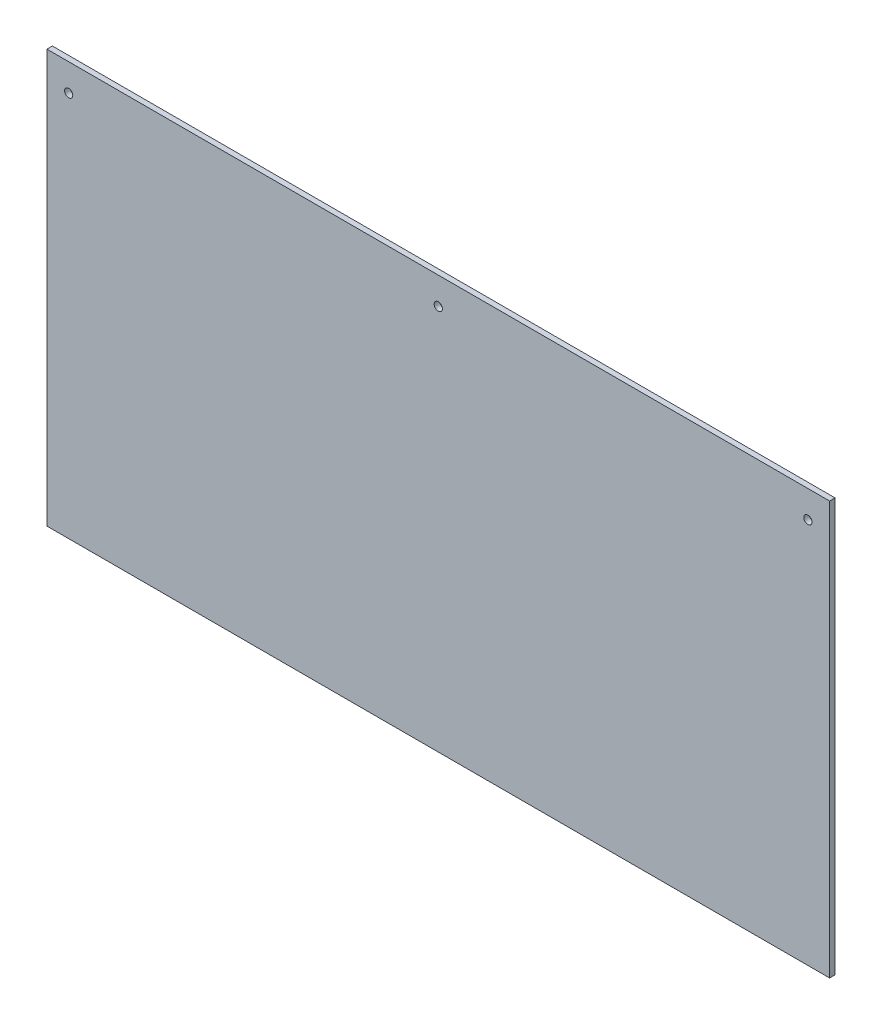
ISO-10303-21;
HEADER;
FILE_DESCRIPTION(('STEP AP214'),'2;1');
FILE_NAME('part.step','',(''),(''),'','','');
FILE_SCHEMA(('AUTOMOTIVE_DESIGN { 1 0 10303 214 1 1 1 1 }'));
ENDSEC;
DATA;
#1=APPLICATION_CONTEXT('core data for automotive mechanical design processes');
#2=APPLICATION_PROTOCOL_DEFINITION('international standard','automotive_design',2000,#1);
#3=PRODUCT_CONTEXT('',#1,'mechanical');
#4=PRODUCT('Part','Part','',(#3));
#5=PRODUCT_RELATED_PRODUCT_CATEGORY('part','',(#4));
#6=PRODUCT_DEFINITION_FORMATION('','',#4);
#7=PRODUCT_DEFINITION_CONTEXT('part definition',#1,'design');
#8=PRODUCT_DEFINITION('design','',#6,#7);
#9=PRODUCT_DEFINITION_SHAPE('','',#8);
#10=(LENGTH_UNIT() NAMED_UNIT(*) SI_UNIT(.MILLI.,.METRE.));
#11=(NAMED_UNIT(*) PLANE_ANGLE_UNIT() SI_UNIT($,.RADIAN.));
#12=(NAMED_UNIT(*) SI_UNIT($,.STERADIAN.) SOLID_ANGLE_UNIT());
#13=UNCERTAINTY_MEASURE_WITH_UNIT(LENGTH_MEASURE(1.E-05),#10,'distance_accuracy_value','');
#14=(GEOMETRIC_REPRESENTATION_CONTEXT(3) GLOBAL_UNCERTAINTY_ASSIGNED_CONTEXT((#13)) GLOBAL_UNIT_ASSIGNED_CONTEXT((#10,
#11,#12)) REPRESENTATION_CONTEXT('',''));
#15=CARTESIAN_POINT('',(0.,0.,0.));
#16=DIRECTION('',(0.,0.,1.));
#17=DIRECTION('',(1.,0.,0.));
#18=AXIS2_PLACEMENT_3D('',#15,#16,#17);
#19=CARTESIAN_POINT('',(889.,450.85,0.));
#20=DIRECTION('',(0.,0.,1.));
#21=DIRECTION('',(1.,0.,0.));
#22=AXIS2_PLACEMENT_3D('',#19,#20,#21);
#23=CYLINDRICAL_SURFACE('',#22,4.7625);
#24=CARTESIAN_POINT('',(889.,450.85,0.));
#25=DIRECTION('',(0.,0.,1.));
#26=DIRECTION('',(1.,0.,0.));
#27=AXIS2_PLACEMENT_3D('',#24,#25,#26);
#28=CIRCLE('',#27,4.7625);
#29=CARTESIAN_POINT('',(893.7625,450.85,0.));
#30=VERTEX_POINT('',#29);
#31=EDGE_CURVE('E48',#30,#30,#28,.T.);
#32=ORIENTED_EDGE('',*,*,#31,.F.);
#33=EDGE_LOOP('',(#32));
#34=FACE_BOUND('',#33,.T.);
#35=CARTESIAN_POINT('',(889.,450.85,6.35));
#36=DIRECTION('',(0.,0.,1.));
#37=DIRECTION('',(1.,0.,0.));
#38=AXIS2_PLACEMENT_3D('',#35,#36,#37);
#39=CIRCLE('',#38,4.7625);
#40=CARTESIAN_POINT('',(893.7625,450.85,6.35));
#41=VERTEX_POINT('',#40);
#42=EDGE_CURVE('E11',#41,#41,#39,.T.);
#43=ORIENTED_EDGE('',*,*,#42,.T.);
#44=EDGE_LOOP('',(#43));
#45=FACE_BOUND('',#44,.T.);
#46=ADVANCED_FACE('F40',(#34,#45),#23,.F.);
#47=CARTESIAN_POINT('',(0.,0.,6.35));
#48=DIRECTION('',(1.,0.,0.));
#49=DIRECTION('',(0.,0.,-1.));
#50=AXIS2_PLACEMENT_3D('',#47,#48,#49);
#51=PLANE('',#50);
#52=DIRECTION('',(0.,-1.,0.));
#53=VECTOR('',#52,1.);
#54=CARTESIAN_POINT('',(0.,0.,0.));
#55=LINE('',#54,#53);
#56=CARTESIAN_POINT('',(0.,482.6,0.));
#57=VERTEX_POINT('',#56);
#58=CARTESIAN_POINT('',(0.,0.,0.));
#59=VERTEX_POINT('',#58);
#60=EDGE_CURVE('E111',#57,#59,#55,.T.);
#61=ORIENTED_EDGE('',*,*,#60,.T.);
#62=DIRECTION('',(0.,0.,-1.));
#63=VECTOR('',#62,1.);
#64=CARTESIAN_POINT('',(0.,0.,6.35));
#65=LINE('',#64,#63);
#66=CARTESIAN_POINT('',(0.,0.,6.35));
#67=VERTEX_POINT('',#66);
#68=EDGE_CURVE('E102',#67,#59,#65,.T.);
#69=ORIENTED_EDGE('',*,*,#68,.F.);
#70=DIRECTION('',(0.,-1.,0.));
#71=VECTOR('',#70,1.);
#72=CARTESIAN_POINT('',(0.,0.,6.35));
#73=LINE('',#72,#71);
#74=CARTESIAN_POINT('',(0.,482.6,6.35));
#75=VERTEX_POINT('',#74);
#76=EDGE_CURVE('E95',#75,#67,#73,.T.);
#77=ORIENTED_EDGE('',*,*,#76,.F.);
#78=DIRECTION('',(0.,0.,-1.));
#79=VECTOR('',#78,1.);
#80=CARTESIAN_POINT('',(0.,482.6,6.35));
#81=LINE('',#80,#79);
#82=EDGE_CURVE('E107',#75,#57,#81,.T.);
#83=ORIENTED_EDGE('',*,*,#82,.T.);
#84=EDGE_LOOP('',(#61,#69,#77,#83));
#85=FACE_BOUND('',#84,.T.);
#86=ADVANCED_FACE('F130',(#85),#51,.F.);
#87=CARTESIAN_POINT('',(0.,0.,6.35));
#88=DIRECTION('',(0.,1.,0.));
#89=DIRECTION('',(0.,0.,1.));
#90=AXIS2_PLACEMENT_3D('',#87,#88,#89);
#91=PLANE('',#90);
#92=DIRECTION('',(1.,0.,0.));
#93=VECTOR('',#92,1.);
#94=CARTESIAN_POINT('',(0.,0.,0.));
#95=LINE('',#94,#93);
#96=CARTESIAN_POINT('',(914.4,0.,0.));
#97=VERTEX_POINT('',#96);
#98=EDGE_CURVE('E101',#59,#97,#95,.T.);
#99=ORIENTED_EDGE('',*,*,#98,.T.);
#100=DIRECTION('',(0.,0.,-1.));
#101=VECTOR('',#100,1.);
#102=CARTESIAN_POINT('',(914.4,0.,6.35));
#103=LINE('',#102,#101);
#104=CARTESIAN_POINT('',(914.4,0.,6.35));
#105=VERTEX_POINT('',#104);
#106=EDGE_CURVE('E99',#105,#97,#103,.T.);
#107=ORIENTED_EDGE('',*,*,#106,.F.);
#108=DIRECTION('',(1.,0.,0.));
#109=VECTOR('',#108,1.);
#110=CARTESIAN_POINT('',(0.,0.,6.35));
#111=LINE('',#110,#109);
#112=EDGE_CURVE('E89',#67,#105,#111,.T.);
#113=ORIENTED_EDGE('',*,*,#112,.F.);
#114=ORIENTED_EDGE('',*,*,#68,.T.);
#115=EDGE_LOOP('',(#99,#107,#113,#114));
#116=FACE_BOUND('',#115,.T.);
#117=ADVANCED_FACE('F100',(#116),#91,.F.);
#118=CARTESIAN_POINT('',(914.4,0.,6.35));
#119=DIRECTION('',(-1.,0.,0.));
#120=DIRECTION('',(0.,0.,1.));
#121=AXIS2_PLACEMENT_3D('',#118,#119,#120);
#122=PLANE('',#121);
#123=DIRECTION('',(0.,1.,0.));
#124=VECTOR('',#123,1.);
#125=CARTESIAN_POINT('',(914.4,0.,0.));
#126=LINE('',#125,#124);
#127=CARTESIAN_POINT('',(914.4,482.6,0.));
#128=VERTEX_POINT('',#127);
#129=EDGE_CURVE('E74',#97,#128,#126,.T.);
#130=ORIENTED_EDGE('',*,*,#129,.T.);
#131=DIRECTION('',(0.,0.,-1.));
#132=VECTOR('',#131,1.);
#133=CARTESIAN_POINT('',(914.4,482.6,6.35));
#134=LINE('',#133,#132);
#135=CARTESIAN_POINT('',(914.4,482.6,6.35));
#136=VERTEX_POINT('',#135);
#137=EDGE_CURVE('E103',#136,#128,#134,.T.);
#138=ORIENTED_EDGE('',*,*,#137,.F.);
#139=DIRECTION('',(0.,1.,0.));
#140=VECTOR('',#139,1.);
#141=CARTESIAN_POINT('',(914.4,0.,6.35));
#142=LINE('',#141,#140);
#143=EDGE_CURVE('E93',#105,#136,#142,.T.);
#144=ORIENTED_EDGE('',*,*,#143,.F.);
#145=ORIENTED_EDGE('',*,*,#106,.T.);
#146=EDGE_LOOP('',(#130,#138,#144,#145));
#147=FACE_BOUND('',#146,.T.);
#148=ADVANCED_FACE('F105',(#147),#122,.F.);
#149=CARTESIAN_POINT('',(0.,482.6,6.35));
#150=DIRECTION('',(0.,-1.,0.));
#151=DIRECTION('',(1.,0.,0.));
#152=AXIS2_PLACEMENT_3D('',#149,#150,#151);
#153=PLANE('',#152);
#154=DIRECTION('',(-1.,0.,0.));
#155=VECTOR('',#154,1.);
#156=CARTESIAN_POINT('',(0.,482.6,0.));
#157=LINE('',#156,#155);
#158=EDGE_CURVE('E80',#128,#57,#157,.T.);
#159=ORIENTED_EDGE('',*,*,#158,.T.);
#160=ORIENTED_EDGE('',*,*,#82,.F.);
#161=DIRECTION('',(-1.,0.,0.));
#162=VECTOR('',#161,1.);
#163=CARTESIAN_POINT('',(0.,482.6,6.35));
#164=LINE('',#163,#162);
#165=EDGE_CURVE('E56',#136,#75,#164,.T.);
#166=ORIENTED_EDGE('',*,*,#165,.F.);
#167=ORIENTED_EDGE('',*,*,#137,.T.);
#168=EDGE_LOOP('',(#159,#160,#166,#167));
#169=FACE_BOUND('',#168,.T.);
#170=ADVANCED_FACE('F133',(#169),#153,.F.);
#171=CARTESIAN_POINT('',(0.,0.,6.35));
#172=DIRECTION('',(0.,0.,-1.));
#173=DIRECTION('',(-1.,0.,0.));
#174=AXIS2_PLACEMENT_3D('',#171,#172,#173);
#175=PLANE('',#174);
#176=CARTESIAN_POINT('',(457.2,450.85,6.35));
#177=DIRECTION('',(0.,0.,1.));
#178=DIRECTION('',(1.,0.,0.));
#179=AXIS2_PLACEMENT_3D('',#176,#177,#178);
#180=CIRCLE('',#179,4.7625);
#181=CARTESIAN_POINT('',(461.9625,450.85,6.35));
#182=VERTEX_POINT('',#181);
#183=EDGE_CURVE('E163',#182,#182,#180,.T.);
#184=ORIENTED_EDGE('',*,*,#183,.F.);
#185=EDGE_LOOP('',(#184));
#186=FACE_BOUND('',#185,.T.);
#187=CARTESIAN_POINT('',(25.4,450.85,6.35));
#188=DIRECTION('',(0.,0.,1.));
#189=DIRECTION('',(1.,0.,0.));
#190=AXIS2_PLACEMENT_3D('',#187,#188,#189);
#191=CIRCLE('',#190,4.7625);
#192=CARTESIAN_POINT('',(30.1625,450.85,6.35));
#193=VERTEX_POINT('',#192);
#194=EDGE_CURVE('E160',#193,#193,#191,.T.);
#195=ORIENTED_EDGE('',*,*,#194,.F.);
#196=EDGE_LOOP('',(#195));
#197=FACE_BOUND('',#196,.T.);
#198=ORIENTED_EDGE('',*,*,#76,.T.);
#199=ORIENTED_EDGE('',*,*,#112,.T.);
#200=ORIENTED_EDGE('',*,*,#143,.T.);
#201=ORIENTED_EDGE('',*,*,#165,.T.);
#202=EDGE_LOOP('',(#198,#199,#200,#201));
#203=FACE_BOUND('',#202,.T.);
#204=ORIENTED_EDGE('',*,*,#42,.F.);
#205=EDGE_LOOP('',(#204));
#206=FACE_BOUND('',#205,.T.);
#207=ADVANCED_FACE('F90',(#186,#197,#203,#206),#175,.F.);
#208=CARTESIAN_POINT('',(0.,0.,0.));
#209=DIRECTION('',(0.,0.,-1.));
#210=DIRECTION('',(-1.,0.,0.));
#211=AXIS2_PLACEMENT_3D('',#208,#209,#210);
#212=PLANE('',#211);
#213=CARTESIAN_POINT('',(457.2,450.85,0.));
#214=DIRECTION('',(0.,0.,1.));
#215=DIRECTION('',(1.,0.,0.));
#216=AXIS2_PLACEMENT_3D('',#213,#214,#215);
#217=CIRCLE('',#216,4.7625);
#218=CARTESIAN_POINT('',(461.9625,450.85,0.));
#219=VERTEX_POINT('',#218);
#220=EDGE_CURVE('E168',#219,#219,#217,.T.);
#221=ORIENTED_EDGE('',*,*,#220,.T.);
#222=EDGE_LOOP('',(#221));
#223=FACE_BOUND('',#222,.T.);
#224=CARTESIAN_POINT('',(25.4,450.85,0.));
#225=DIRECTION('',(0.,0.,1.));
#226=DIRECTION('',(1.,0.,0.));
#227=AXIS2_PLACEMENT_3D('',#224,#225,#226);
#228=CIRCLE('',#227,4.7625);
#229=CARTESIAN_POINT('',(30.1625,450.85,0.));
#230=VERTEX_POINT('',#229);
#231=EDGE_CURVE('E115',#230,#230,#228,.T.);
#232=ORIENTED_EDGE('',*,*,#231,.T.);
#233=EDGE_LOOP('',(#232));
#234=FACE_BOUND('',#233,.T.);
#235=ORIENTED_EDGE('',*,*,#60,.F.);
#236=ORIENTED_EDGE('',*,*,#158,.F.);
#237=ORIENTED_EDGE('',*,*,#129,.F.);
#238=ORIENTED_EDGE('',*,*,#98,.F.);
#239=EDGE_LOOP('',(#235,#236,#237,#238));
#240=FACE_BOUND('',#239,.T.);
#241=ORIENTED_EDGE('',*,*,#31,.T.);
#242=EDGE_LOOP('',(#241));
#243=FACE_BOUND('',#242,.T.);
#244=ADVANCED_FACE('F126',(#223,#234,#240,#243),#212,.T.);
#245=CARTESIAN_POINT('',(25.4,450.85,0.));
#246=DIRECTION('',(0.,0.,1.));
#247=DIRECTION('',(1.,0.,0.));
#248=AXIS2_PLACEMENT_3D('',#245,#246,#247);
#249=CYLINDRICAL_SURFACE('',#248,4.7625);
#250=ORIENTED_EDGE('',*,*,#231,.F.);
#251=EDGE_LOOP('',(#250));
#252=FACE_BOUND('',#251,.T.);
#253=ORIENTED_EDGE('',*,*,#194,.T.);
#254=EDGE_LOOP('',(#253));
#255=FACE_BOUND('',#254,.T.);
#256=ADVANCED_FACE('F140',(#252,#255),#249,.F.);
#257=CARTESIAN_POINT('',(457.2,450.85,0.));
#258=DIRECTION('',(0.,0.,1.));
#259=DIRECTION('',(1.,0.,0.));
#260=AXIS2_PLACEMENT_3D('',#257,#258,#259);
#261=CYLINDRICAL_SURFACE('',#260,4.7625);
#262=ORIENTED_EDGE('',*,*,#220,.F.);
#263=EDGE_LOOP('',(#262));
#264=FACE_BOUND('',#263,.T.);
#265=ORIENTED_EDGE('',*,*,#183,.T.);
#266=EDGE_LOOP('',(#265));
#267=FACE_BOUND('',#266,.T.);
#268=ADVANCED_FACE('F173',(#264,#267),#261,.F.);
#269=CLOSED_SHELL('',(#46,#86,#117,#148,#170,#207,#244,#256,#268));
#270=MANIFOLD_SOLID_BREP('B2',#269);
#271=ADVANCED_BREP_SHAPE_REPRESENTATION('',(#18,#270),#14);
#272=SHAPE_DEFINITION_REPRESENTATION(#9,#271);
ENDSEC;
END-ISO-10303-21;
